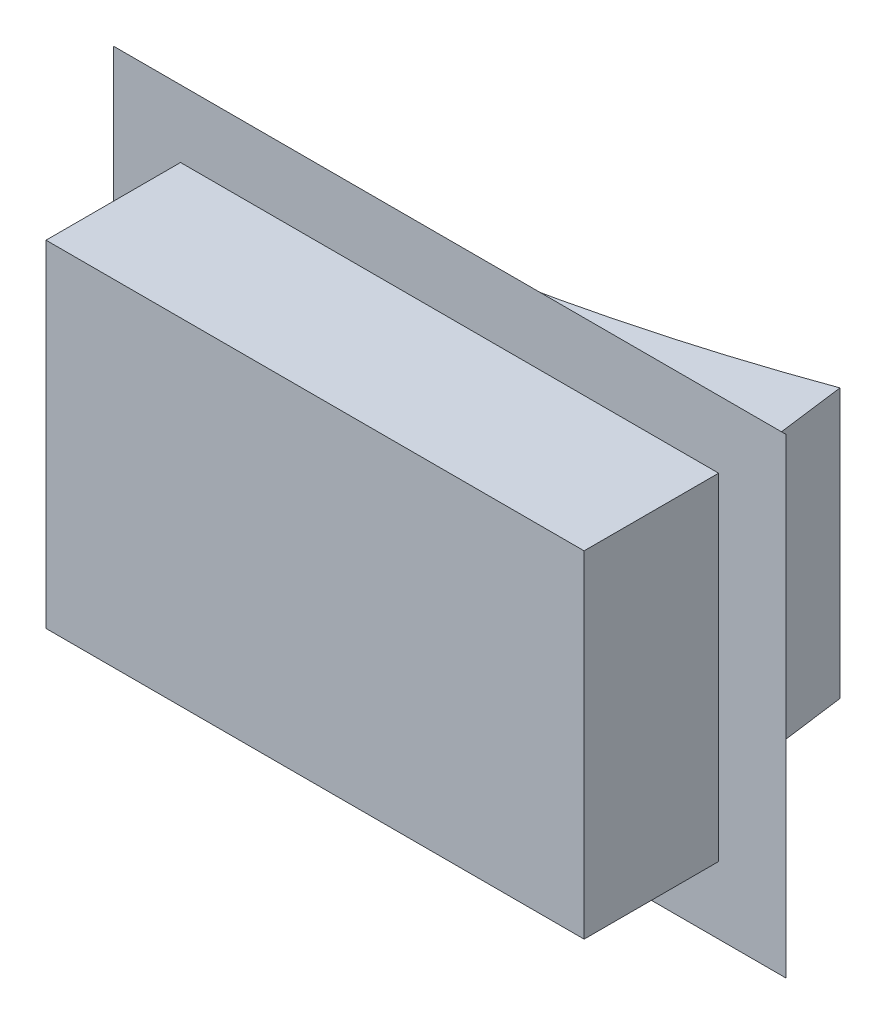
ISO-10303-21;
HEADER;
FILE_DESCRIPTION(('STEP AP214'),'2;1');
FILE_NAME('part.step','',(''),(''),'','','');
FILE_SCHEMA(('AUTOMOTIVE_DESIGN { 1 0 10303 214 1 1 1 1 }'));
ENDSEC;
DATA;
#1=APPLICATION_CONTEXT('core data for automotive mechanical design processes');
#2=APPLICATION_PROTOCOL_DEFINITION('international standard','automotive_design',2000,#1);
#3=PRODUCT_CONTEXT('',#1,'mechanical');
#4=PRODUCT('Part','Part','',(#3));
#5=PRODUCT_RELATED_PRODUCT_CATEGORY('part','',(#4));
#6=PRODUCT_DEFINITION_FORMATION('','',#4);
#7=PRODUCT_DEFINITION_CONTEXT('part definition',#1,'design');
#8=PRODUCT_DEFINITION('design','',#6,#7);
#9=PRODUCT_DEFINITION_SHAPE('','',#8);
#10=(LENGTH_UNIT() NAMED_UNIT(*) SI_UNIT(.MILLI.,.METRE.));
#11=(NAMED_UNIT(*) PLANE_ANGLE_UNIT() SI_UNIT($,.RADIAN.));
#12=(NAMED_UNIT(*) SI_UNIT($,.STERADIAN.) SOLID_ANGLE_UNIT());
#13=UNCERTAINTY_MEASURE_WITH_UNIT(LENGTH_MEASURE(1.E-05),#10,'distance_accuracy_value','');
#14=(GEOMETRIC_REPRESENTATION_CONTEXT(3) GLOBAL_UNCERTAINTY_ASSIGNED_CONTEXT((#13)) GLOBAL_UNIT_ASSIGNED_CONTEXT((#10,
#11,#12)) REPRESENTATION_CONTEXT('',''));
#15=CARTESIAN_POINT('',(0.,0.,0.));
#16=DIRECTION('',(0.,0.,1.));
#17=DIRECTION('',(1.,0.,0.));
#18=AXIS2_PLACEMENT_3D('',#15,#16,#17);
#19=CARTESIAN_POINT('',(6.99999999999999,-3.99999999999999,-3.));
#20=DIRECTION('',(0.,1.,0.));
#21=DIRECTION('',(0.,0.,1.));
#22=AXIS2_PLACEMENT_3D('',#19,#20,#21);
#23=PLANE('',#22);
#24=DIRECTION('',(-0.129572024776295,0.,-0.991570012856062));
#25=VECTOR('',#24,1.);
#26=CARTESIAN_POINT('',(6.61456079718034,-3.99999999999999,-2.94963327118611));
#27=LINE('',#26,#25);
#28=CARTESIAN_POINT('',(6.99999999999999,-3.99999999999999,0.));
#29=VERTEX_POINT('',#28);
#30=CARTESIAN_POINT('',(6.60797919532756,-3.99999999999999,-3.));
#31=VERTEX_POINT('',#30);
#32=EDGE_CURVE('E238',#29,#31,#27,.T.);
#33=ORIENTED_EDGE('',*,*,#32,.F.);
#34=DIRECTION('',(-1.,0.,0.));
#35=VECTOR('',#34,1.);
#36=CARTESIAN_POINT('',(6.99999999999999,-3.99999999999999,0.));
#37=LINE('',#36,#35);
#38=CARTESIAN_POINT('',(-6.99999999999999,-3.99999999999999,0.));
#39=VERTEX_POINT('',#38);
#40=EDGE_CURVE('E374',#29,#39,#37,.T.);
#41=ORIENTED_EDGE('',*,*,#40,.T.);
#42=CARTESIAN_POINT('',(6.60797919532756,-3.99999999999999,-3.));
#43=CARTESIAN_POINT('',(-0.0193159583533921,-3.99999999999999,-0.580486073640321));
#44=CARTESIAN_POINT('',(-6.99999999999999,-3.99999999999999,0.));
#45=B_SPLINE_CURVE_WITH_KNOTS('',2,(#42,#43,#44),.UNSPECIFIED.,.F.,.F.,(3,3),(0.,1.),.UNSPECIFIED.);
#46=EDGE_CURVE('E406',#31,#39,#45,.T.);
#47=ORIENTED_EDGE('',*,*,#46,.F.);
#48=EDGE_LOOP('',(#33,#41,#47));
#49=FACE_BOUND('',#48,.T.);
#50=ADVANCED_FACE('F59',(#49),#23,.F.);
#51=CARTESIAN_POINT('',(6.99999999999999,3.99999999999999,-3.));
#52=DIRECTION('',(0.,-1.,0.));
#53=DIRECTION('',(0.,0.,-1.));
#54=AXIS2_PLACEMENT_3D('',#51,#52,#53);
#55=PLANE('',#54);
#56=DIRECTION('',(-0.129572024776295,0.,-0.991570012856062));
#57=VECTOR('',#56,1.);
#58=CARTESIAN_POINT('',(6.88247763276759,3.99999999999999,-0.899358139912518));
#59=LINE('',#58,#57);
#60=CARTESIAN_POINT('',(6.99999999999999,3.99999999999999,0.));
#61=VERTEX_POINT('',#60);
#62=CARTESIAN_POINT('',(6.60797919532756,3.99999999999999,-3.));
#63=VERTEX_POINT('',#62);
#64=EDGE_CURVE('E235',#61,#63,#59,.T.);
#65=ORIENTED_EDGE('',*,*,#64,.T.);
#66=CARTESIAN_POINT('',(6.60797919532756,3.99999999999999,-3.));
#67=CARTESIAN_POINT('',(-0.0193159583533921,3.99999999999999,-0.580486073640321));
#68=CARTESIAN_POINT('',(-6.99999999999999,3.99999999999999,0.));
#69=B_SPLINE_CURVE_WITH_KNOTS('',2,(#66,#67,#68),.UNSPECIFIED.,.F.,.F.,(3,3),(0.,1.),.UNSPECIFIED.);
#70=CARTESIAN_POINT('',(-6.99999999999999,3.99999999999999,0.));
#71=VERTEX_POINT('',#70);
#72=EDGE_CURVE('E240',#63,#71,#69,.T.);
#73=ORIENTED_EDGE('',*,*,#72,.T.);
#74=DIRECTION('',(1.,0.,0.));
#75=VECTOR('',#74,1.);
#76=CARTESIAN_POINT('',(6.99999999999999,3.99999999999999,0.));
#77=LINE('',#76,#75);
#78=EDGE_CURVE('E373',#71,#61,#77,.T.);
#79=ORIENTED_EDGE('',*,*,#78,.T.);
#80=EDGE_LOOP('',(#65,#73,#79));
#81=FACE_BOUND('',#80,.T.);
#82=ADVANCED_FACE('F263',(#81),#55,.F.);
#83=CARTESIAN_POINT('',(0.,0.,0.));
#84=DIRECTION('',(0.,0.,1.));
#85=DIRECTION('',(1.,0.,0.));
#86=AXIS2_PLACEMENT_3D('',#83,#84,#85);
#87=PLANE('',#86);
#88=ORIENTED_EDGE('',*,*,#40,.F.);
#89=DIRECTION('',(0.,-1.,0.));
#90=VECTOR('',#89,1.);
#91=CARTESIAN_POINT('',(6.99999999999999,-3.99999999999999,0.));
#92=LINE('',#91,#90);
#93=EDGE_CURVE('E379',#61,#29,#92,.T.);
#94=ORIENTED_EDGE('',*,*,#93,.F.);
#95=ORIENTED_EDGE('',*,*,#78,.F.);
#96=DIRECTION('',(0.,1.,0.));
#97=VECTOR('',#96,1.);
#98=CARTESIAN_POINT('',(-6.99999999999999,-3.99999999999999,0.));
#99=LINE('',#98,#97);
#100=EDGE_CURVE('E371',#39,#71,#99,.T.);
#101=ORIENTED_EDGE('',*,*,#100,.F.);
#102=EDGE_LOOP('',(#88,#94,#95,#101));
#103=FACE_BOUND('',#102,.T.);
#104=DIRECTION('',(-1.,0.,0.));
#105=VECTOR('',#104,1.);
#106=CARTESIAN_POINT('',(0.,-4.99999999999999,0.));
#107=LINE('',#106,#105);
#108=CARTESIAN_POINT('',(7.99999999999999,-4.99999999999999,0.));
#109=VERTEX_POINT('',#108);
#110=CARTESIAN_POINT('',(-7.99999999999999,-4.99999999999999,0.));
#111=VERTEX_POINT('',#110);
#112=EDGE_CURVE('E430',#109,#111,#107,.T.);
#113=ORIENTED_EDGE('',*,*,#112,.T.);
#114=DIRECTION('',(0.,1.,0.));
#115=VECTOR('',#114,1.);
#116=CARTESIAN_POINT('',(-7.99999999999999,0.,0.));
#117=LINE('',#116,#115);
#118=CARTESIAN_POINT('',(-7.99999999999999,4.99999999999999,0.));
#119=VERTEX_POINT('',#118);
#120=EDGE_CURVE('E386',#111,#119,#117,.T.);
#121=ORIENTED_EDGE('',*,*,#120,.T.);
#122=DIRECTION('',(1.,0.,0.));
#123=VECTOR('',#122,1.);
#124=CARTESIAN_POINT('',(0.,4.99999999999999,0.));
#125=LINE('',#124,#123);
#126=CARTESIAN_POINT('',(7.99999999999999,4.99999999999999,0.));
#127=VERTEX_POINT('',#126);
#128=EDGE_CURVE('E355',#119,#127,#125,.T.);
#129=ORIENTED_EDGE('',*,*,#128,.T.);
#130=DIRECTION('',(0.,-1.,0.));
#131=VECTOR('',#130,1.);
#132=CARTESIAN_POINT('',(7.99999999999999,0.,0.));
#133=LINE('',#132,#131);
#134=EDGE_CURVE('E427',#127,#109,#133,.T.);
#135=ORIENTED_EDGE('',*,*,#134,.T.);
#136=EDGE_LOOP('',(#113,#121,#129,#135));
#137=FACE_BOUND('',#136,.T.);
#138=ADVANCED_FACE('F326',(#103,#137),#87,.F.);
#139=CARTESIAN_POINT('',(0.,0.,2.));
#140=DIRECTION('',(0.,0.,1.));
#141=DIRECTION('',(1.,0.,0.));
#142=AXIS2_PLACEMENT_3D('',#139,#140,#141);
#143=PLANE('',#142);
#144=DIRECTION('',(0.,-1.,0.));
#145=VECTOR('',#144,1.);
#146=CARTESIAN_POINT('',(-8.,5.,2.));
#147=LINE('',#146,#145);
#148=CARTESIAN_POINT('',(-8.,5.,2.));
#149=VERTEX_POINT('',#148);
#150=CARTESIAN_POINT('',(-8.,-5.,2.));
#151=VERTEX_POINT('',#150);
#152=EDGE_CURVE('E87',#149,#151,#147,.T.);
#153=ORIENTED_EDGE('',*,*,#152,.F.);
#154=DIRECTION('',(-1.,0.,0.));
#155=VECTOR('',#154,1.);
#156=CARTESIAN_POINT('',(-8.,5.,2.));
#157=LINE('',#156,#155);
#158=CARTESIAN_POINT('',(8.,5.,2.));
#159=VERTEX_POINT('',#158);
#160=EDGE_CURVE('E209',#159,#149,#157,.T.);
#161=ORIENTED_EDGE('',*,*,#160,.F.);
#162=DIRECTION('',(0.,1.,0.));
#163=VECTOR('',#162,1.);
#164=CARTESIAN_POINT('',(8.,5.,2.));
#165=LINE('',#164,#163);
#166=CARTESIAN_POINT('',(8.,-5.,2.));
#167=VERTEX_POINT('',#166);
#168=EDGE_CURVE('E220',#167,#159,#165,.T.);
#169=ORIENTED_EDGE('',*,*,#168,.F.);
#170=DIRECTION('',(1.,0.,0.));
#171=VECTOR('',#170,1.);
#172=CARTESIAN_POINT('',(-8.,-5.,2.));
#173=LINE('',#172,#171);
#174=EDGE_CURVE('E217',#151,#167,#173,.T.);
#175=ORIENTED_EDGE('',*,*,#174,.F.);
#176=EDGE_LOOP('',(#153,#161,#169,#175));
#177=FACE_BOUND('',#176,.T.);
#178=DIRECTION('',(0.,-1.,0.));
#179=VECTOR('',#178,1.);
#180=CARTESIAN_POINT('',(-10.,7.,2.));
#181=LINE('',#180,#179);
#182=CARTESIAN_POINT('',(-10.,7.,2.));
#183=VERTEX_POINT('',#182);
#184=CARTESIAN_POINT('',(-10.,-7.,2.));
#185=VERTEX_POINT('',#184);
#186=EDGE_CURVE('E360',#183,#185,#181,.T.);
#187=ORIENTED_EDGE('',*,*,#186,.T.);
#188=DIRECTION('',(1.,0.,0.));
#189=VECTOR('',#188,1.);
#190=CARTESIAN_POINT('',(-10.,-7.,2.));
#191=LINE('',#190,#189);
#192=CARTESIAN_POINT('',(10.,-7.,2.));
#193=VERTEX_POINT('',#192);
#194=EDGE_CURVE('E364',#185,#193,#191,.T.);
#195=ORIENTED_EDGE('',*,*,#194,.T.);
#196=DIRECTION('',(0.,1.,0.));
#197=VECTOR('',#196,1.);
#198=CARTESIAN_POINT('',(10.,7.,2.));
#199=LINE('',#198,#197);
#200=CARTESIAN_POINT('',(10.,7.,2.));
#201=VERTEX_POINT('',#200);
#202=EDGE_CURVE('E424',#193,#201,#199,.T.);
#203=ORIENTED_EDGE('',*,*,#202,.T.);
#204=DIRECTION('',(-1.,0.,0.));
#205=VECTOR('',#204,1.);
#206=CARTESIAN_POINT('',(-10.,7.,2.));
#207=LINE('',#206,#205);
#208=EDGE_CURVE('E357',#201,#183,#207,.T.);
#209=ORIENTED_EDGE('',*,*,#208,.T.);
#210=EDGE_LOOP('',(#187,#195,#203,#209));
#211=FACE_BOUND('',#210,.T.);
#212=ADVANCED_FACE('F330',(#177,#211),#143,.T.);
#213=CARTESIAN_POINT('',(10.,7.,2.00000000000001));
#214=DIRECTION('',(-0.707106781186546,0.,0.707106781186549));
#215=DIRECTION('',(0.,1.,0.));
#216=AXIS2_PLACEMENT_3D('',#213,#214,#215);
#217=PLANE('',#216);
#218=DIRECTION('',(-0.577350269189626,0.577350269189627,-0.577350269189625));
#219=VECTOR('',#218,1.);
#220=CARTESIAN_POINT('',(5.33333333333332,-2.33333333333332,-2.66666666666666));
#221=LINE('',#220,#219);
#222=EDGE_CURVE('E361',#109,#193,#221,.F.);
#223=ORIENTED_EDGE('',*,*,#222,.F.);
#224=ORIENTED_EDGE('',*,*,#134,.F.);
#225=DIRECTION('',(0.577350269189627,0.577350269189626,0.577350269189624));
#226=VECTOR('',#225,1.);
#227=CARTESIAN_POINT('',(10.,7.,2.00000000000001));
#228=LINE('',#227,#226);
#229=EDGE_CURVE('E353',#201,#127,#228,.F.);
#230=ORIENTED_EDGE('',*,*,#229,.F.);
#231=ORIENTED_EDGE('',*,*,#202,.F.);
#232=EDGE_LOOP('',(#223,#224,#230,#231));
#233=FACE_BOUND('',#232,.T.);
#234=ADVANCED_FACE('F61',(#233),#217,.F.);
#235=CARTESIAN_POINT('',(-10.,7.,2.00000000000001));
#236=DIRECTION('',(0.,-0.707106781186546,0.707106781186549));
#237=DIRECTION('',(-1.,0.,0.));
#238=AXIS2_PLACEMENT_3D('',#235,#236,#237);
#239=PLANE('',#238);
#240=ORIENTED_EDGE('',*,*,#229,.T.);
#241=ORIENTED_EDGE('',*,*,#128,.F.);
#242=DIRECTION('',(-0.577350269189627,0.577350269189626,0.577350269189624));
#243=VECTOR('',#242,1.);
#244=CARTESIAN_POINT('',(-10.,7.,2.00000000000001));
#245=LINE('',#244,#243);
#246=EDGE_CURVE('E367',#183,#119,#245,.F.);
#247=ORIENTED_EDGE('',*,*,#246,.F.);
#248=ORIENTED_EDGE('',*,*,#208,.F.);
#249=EDGE_LOOP('',(#240,#241,#247,#248));
#250=FACE_BOUND('',#249,.T.);
#251=ADVANCED_FACE('F341',(#250),#239,.F.);
#252=CARTESIAN_POINT('',(-10.,-7.,2.00000000000001));
#253=DIRECTION('',(0.,0.707106781186546,0.707106781186549));
#254=DIRECTION('',(1.,0.,0.));
#255=AXIS2_PLACEMENT_3D('',#252,#253,#254);
#256=PLANE('',#255);
#257=ORIENTED_EDGE('',*,*,#222,.T.);
#258=ORIENTED_EDGE('',*,*,#194,.F.);
#259=DIRECTION('',(0.577350269189626,0.577350269189627,-0.577350269189625));
#260=VECTOR('',#259,1.);
#261=CARTESIAN_POINT('',(-10.,-7.,2.00000000000001));
#262=LINE('',#261,#260);
#263=EDGE_CURVE('E421',#111,#185,#262,.F.);
#264=ORIENTED_EDGE('',*,*,#263,.F.);
#265=ORIENTED_EDGE('',*,*,#112,.F.);
#266=EDGE_LOOP('',(#257,#258,#264,#265));
#267=FACE_BOUND('',#266,.T.);
#268=ADVANCED_FACE('F338',(#267),#256,.F.);
#269=CARTESIAN_POINT('',(-10.,7.,2.00000000000001));
#270=DIRECTION('',(0.707106781186546,0.,0.707106781186549));
#271=DIRECTION('',(0.,-1.,0.));
#272=AXIS2_PLACEMENT_3D('',#269,#270,#271);
#273=PLANE('',#272);
#274=ORIENTED_EDGE('',*,*,#246,.T.);
#275=ORIENTED_EDGE('',*,*,#120,.F.);
#276=ORIENTED_EDGE('',*,*,#263,.T.);
#277=ORIENTED_EDGE('',*,*,#186,.F.);
#278=EDGE_LOOP('',(#274,#275,#276,#277));
#279=FACE_BOUND('',#278,.T.);
#280=ADVANCED_FACE('F259',(#279),#273,.F.);
#281=CARTESIAN_POINT('',(6.60797919532756,-7.,-3.));
#282=CARTESIAN_POINT('',(-0.0193159583533921,-7.,-0.580486073640321));
#283=CARTESIAN_POINT('',(-6.99999999999999,-7.,0.));
#284=B_SPLINE_CURVE_WITH_KNOTS('',2,(#281,#282,#283),.UNSPECIFIED.,.F.,.F.,(3,3),(0.,1.),.UNSPECIFIED.);
#285=DIRECTION('',(0.,1.,0.));
#286=VECTOR('',#285,1.);
#287=SURFACE_OF_LINEAR_EXTRUSION('',#284,#286);
#288=CARTESIAN_POINT('',(1.65480843202351,0.,-1.46116990666255));
#289=CARTESIAN_POINT('',(1.65481341233763,0.112664800283501,-1.46117084827088));
#290=CARTESIAN_POINT('',(1.66404705270996,0.22541058939595,-1.46354440550255));
#291=CARTESIAN_POINT('',(1.70073725397097,0.447787466047836,-1.47300723441244));
#292=CARTESIAN_POINT('',(1.72821549737535,0.557414685515593,-1.48010211709925));
#293=CARTESIAN_POINT('',(1.80056092337885,0.770292897302324,-1.49888589938621));
#294=CARTESIAN_POINT('',(1.84541784947889,0.873547608937413,-1.51057208935952));
#295=CARTESIAN_POINT('',(1.95116598911321,1.07080665406106,-1.53832840481656));
#296=CARTESIAN_POINT('',(2.01205335250087,1.16481320131119,-1.55439747766476));
#297=CARTESIAN_POINT('',(2.14824268002035,1.34123433585223,-1.59066885764276));
#298=CARTESIAN_POINT('',(2.22358292240596,1.42361710899337,-1.61088215068325));
#299=CARTESIAN_POINT('',(2.38635302261262,1.57423480648571,-1.65501107461084));
#300=CARTESIAN_POINT('',(2.47378368130846,1.64246879286573,-1.6789269507713));
#301=CARTESIAN_POINT('',(2.65885517205477,1.7633928348455,-1.73013202447015));
#302=CARTESIAN_POINT('',(2.75656443130673,1.81596845820123,-1.75744408280176));
#303=CARTESIAN_POINT('',(2.95885224913992,1.90354338412519,-1.8146746492243));
#304=CARTESIAN_POINT('',(3.06343115486114,1.93854179770029,-1.84459328905712));
#305=CARTESIAN_POINT('',(3.27758534794232,1.99035328705018,-1.90661655981823));
#306=CARTESIAN_POINT('',(3.3872004511933,2.00697898619254,-1.93874022851731));
#307=CARTESIAN_POINT('',(3.60734142661627,2.0210342489472,-2.0040497127107));
#308=CARTESIAN_POINT('',(3.7178673531134,2.01846265915706,-2.03723559190495));
#309=CARTESIAN_POINT('',(3.93783877551272,1.99412981457498,-2.10406521778934));
#310=CARTESIAN_POINT('',(4.04726323994485,1.97218176179698,-2.13771027451615));
#311=CARTESIAN_POINT('',(4.26086405346146,1.90946427013051,-2.20411980128668));
#312=CARTESIAN_POINT('',(4.36504018837662,1.86869406385268,-2.2368842353693));
#313=CARTESIAN_POINT('',(4.56558433868663,1.7692538455742,-2.30059411631693));
#314=CARTESIAN_POINT('',(4.66192307530879,1.71052029426575,-2.33153263355624));
#315=CARTESIAN_POINT('',(4.84361074487317,1.5767861117278,-2.39039514294641));
#316=CARTESIAN_POINT('',(4.92895994801507,1.50178588056892,-2.41831920921084));
#317=CARTESIAN_POINT('',(5.08556669817263,1.33817912283294,-2.46993166334587));
#318=CARTESIAN_POINT('',(5.15692406808092,1.24967764039768,-2.49364993117687));
#319=CARTESIAN_POINT('',(5.28416937231153,1.06112480673302,-2.53618218236411));
#320=CARTESIAN_POINT('',(5.34005879970841,0.961074571592516,-2.55499663906046));
#321=CARTESIAN_POINT('',(5.4338179760889,0.754053645885342,-2.58668092181251));
#322=CARTESIAN_POINT('',(5.47197431644078,0.64722722471846,-2.59964518734543));
#323=CARTESIAN_POINT('',(5.53042829718103,0.428260325908575,-2.61954569348763));
#324=CARTESIAN_POINT('',(5.55072787954134,0.316120427519188,-2.62648258958905));
#325=CARTESIAN_POINT('',(5.57263296222515,0.0916963116153321,-2.63396951866888));
#326=CARTESIAN_POINT('',(5.57454149763367,-0.0205549712275451,-2.63462308365859));
#327=CARTESIAN_POINT('',(5.56039560049537,-0.243781904550802,-2.62978639712733));
#328=CARTESIAN_POINT('',(5.54434198183619,-0.354757612598891,-2.62429642397775));
#329=CARTESIAN_POINT('',(5.49490806370793,-0.571699442172992,-2.60744670385495));
#330=CARTESIAN_POINT('',(5.46161808407243,-0.677688565806307,-2.596117555991));
#331=CARTESIAN_POINT('',(5.37877907773284,-0.882340809093533,-2.56806343376963));
#332=CARTESIAN_POINT('',(5.32922943069089,-0.981003649059367,-2.55133825354352));
#333=CARTESIAN_POINT('',(5.2147861907529,-1.1692479219407,-2.51295463335315));
#334=CARTESIAN_POINT('',(5.14975095875642,-1.25873391581195,-2.4912507267995));
#335=CARTESIAN_POINT('',(5.0064709177009,-1.42518153366579,-2.44380798989292));
#336=CARTESIAN_POINT('',(4.92822491508212,-1.50214202476587,-2.4180687949769));
#337=CARTESIAN_POINT('',(4.75921084514469,-1.64279693556785,-2.36297251644969));
#338=CARTESIAN_POINT('',(4.66824608043816,-1.7062331386472,-2.33355957924783));
#339=CARTESIAN_POINT('',(4.4774115390904,-1.81644072638669,-2.27248518689078));
#340=CARTESIAN_POINT('',(4.37754100017062,-1.86321068280538,-2.24082353930737));
#341=CARTESIAN_POINT('',(4.17008568547058,-1.93942812590641,-2.1757804072069));
#342=CARTESIAN_POINT('',(4.06240845941434,-1.96860838483939,-2.14238037875579));
#343=CARTESIAN_POINT('',(3.84368617973031,-2.00774094864658,-2.07533387096633));
#344=CARTESIAN_POINT('',(3.73264099617735,-2.01769251077764,-2.0416873821584));
#345=CARTESIAN_POINT('',(3.50978922110098,-2.01804637665744,-1.97497573692674));
#346=CARTESIAN_POINT('',(3.39798146168729,-2.00835971505353,-1.94191391355813));
#347=CARTESIAN_POINT('',(3.1773230063116,-1.96945057556004,-1.87744813232416));
#348=CARTESIAN_POINT('',(3.06847224926305,-1.94022850155814,-1.84604414019822));
#349=CARTESIAN_POINT('',(2.85751713148761,-1.86320627869594,-1.78588654496104));
#350=CARTESIAN_POINT('',(2.7553782613066,-1.8155115735085,-1.75711902493991));
#351=CARTESIAN_POINT('',(2.56022033457852,-1.70281141466052,-1.70274051951436));
#352=CARTESIAN_POINT('',(2.46720043840801,-1.63780755678061,-1.67712924344496));
#353=CARTESIAN_POINT('',(2.29400839850426,-1.4930613385553,-1.62989744081987));
#354=CARTESIAN_POINT('',(2.21371183020602,-1.41348057199154,-1.60823790520514));
#355=CARTESIAN_POINT('',(2.0672117389465,-1.24134495916582,-1.56903245636426));
#356=CARTESIAN_POINT('',(2.00101097404796,-1.14878757969301,-1.55148734812175));
#357=CARTESIAN_POINT('',(1.88528519357723,-0.954269752369079,-1.52100284386336));
#358=CARTESIAN_POINT('',(1.83561399181287,-0.852402479040277,-1.50802301123006));
#359=CARTESIAN_POINT('',(1.75367659840654,-0.64153737688185,-1.48669614691057));
#360=CARTESIAN_POINT('',(1.72138889377021,-0.532548549629497,-1.47834338860393));
#361=CARTESIAN_POINT('',(1.68382589899677,-0.352375896058858,-1.46864357546745));
#362=CARTESIAN_POINT('',(1.67295878066206,-0.282383643832943,-1.46584329098703));
#363=CARTESIAN_POINT('',(1.65844849398943,-0.141604925762726,-1.4621061637612));
#364=CARTESIAN_POINT('',(1.65480530151436,-0.0708184625729001,-1.46116931478954));
#365=CARTESIAN_POINT('',(1.65480843202351,0.,-1.46116990666255));
#366=B_SPLINE_CURVE_WITH_KNOTS('',3,(#288,#289,#290,#291,#292,#293,#294,#295,#296,#297,#298,
#299,#300,#301,#302,#303,#304,#305,#306,#307,#308,#309,#310,#311,#312,#313,#314,#315,#316,#317,
#318,#319,#320,#321,#322,#323,#324,#325,#326,#327,#328,#329,#330,#331,#332,#333,#334,#335,#336,
#337,#338,#339,#340,#341,#342,#343,#344,#345,#346,#347,#348,#349,#350,#351,#352,#353,#354,#355,
#356,#357,#358,#359,#360,#361,#362,#363,#364,#365),.UNSPECIFIED.,.T.,.F.,(4,2,2,2,2,2,2,2,2,2,2,
2,2,2,2,2,2,2,2,2,2,2,2,2,2,2,2,2,2,2,2,2,2,2,2,2,2,2,4),(0.,0.337735239498443,
0.675872575355776,1.01381065358255,1.35166764069082,1.6904321096018,2.02921902918659,
2.37042427283625,2.71164677170357,3.05631804762945,3.40101003209882,3.74906174073406,
4.09712764087888,4.44643923208341,4.79574223312293,5.14245444563248,5.48913317935966,
5.82999554882133,6.17082084397066,6.50602045508494,6.84120487850103,7.17465042405006,
7.50810869267282,7.84474276780297,8.18140727326194,8.52401591961222,8.86665391931811,
9.21437414630054,9.56210780433633,9.91142029007238,10.260725554121,10.6080656546468,
10.9553737439687,11.2990421550401,11.642777748503,11.9833871486186,12.3235740520346,
12.5358672463109,12.7481597312555),.UNSPECIFIED.);
#367=CARTESIAN_POINT('',(1.65480843202351,0.,-1.46116990666255));
#368=VERTEX_POINT('',#367);
#369=EDGE_CURVE('E63',#368,#368,#366,.T.);
#370=ORIENTED_EDGE('',*,*,#369,.F.);
#371=EDGE_LOOP('',(#370));
#372=FACE_BOUND('',#371,.T.);
#373=DIRECTION('',(0.,1.,0.));
#374=VECTOR('',#373,1.);
#375=CARTESIAN_POINT('',(-1.07242692866783,0.,-0.837152206251275));
#376=LINE('',#375,#374);
#377=CARTESIAN_POINT('',(-1.07242692866783,0.15,-0.837152206251279));
#378=VERTEX_POINT('',#377);
#379=CARTESIAN_POINT('',(-1.07242692866777,-0.149999999999999,-0.837152206251287));
#380=VERTEX_POINT('',#379);
#381=EDGE_CURVE('E12',#378,#380,#376,.F.);
#382=ORIENTED_EDGE('',*,*,#381,.F.);
#383=CARTESIAN_POINT('',(6.60797919532756,0.150000000000001,-3.));
#384=CARTESIAN_POINT('',(-0.0193159583533921,0.150000000000001,-0.580486073640321));
#385=CARTESIAN_POINT('',(-6.99999999999999,0.150000000000001,0.));
#386=B_SPLINE_CURVE_WITH_KNOTS('',2,(#383,#384,#385),.UNSPECIFIED.,.F.,.F.,(3,3),(0.,1.),.UNSPECIFIED.);
#387=CARTESIAN_POINT('',(-5.28088812881384,0.150000000000001,-0.1714611430031));
#388=VERTEX_POINT('',#387);
#389=EDGE_CURVE('E72',#388,#378,#386,.F.);
#390=ORIENTED_EDGE('',*,*,#389,.F.);
#391=DIRECTION('',(0.,1.,0.));
#392=VECTOR('',#391,1.);
#393=CARTESIAN_POINT('',(-5.28088812881384,0.,-0.1714611430031));
#394=LINE('',#393,#392);
#395=CARTESIAN_POINT('',(-5.28088812880434,-0.149999999999999,-0.171461142930383));
#396=VERTEX_POINT('',#395);
#397=EDGE_CURVE('E392',#396,#388,#394,.T.);
#398=ORIENTED_EDGE('',*,*,#397,.F.);
#399=CARTESIAN_POINT('',(6.60797919532756,-0.149999999999999,-3.));
#400=CARTESIAN_POINT('',(-0.0193159583533921,-0.149999999999999,-0.580486073640321));
#401=CARTESIAN_POINT('',(-6.99999999999999,-0.149999999999999,0.));
#402=B_SPLINE_CURVE_WITH_KNOTS('',2,(#399,#400,#401),.UNSPECIFIED.,.F.,.F.,(3,3),(0.,1.),.UNSPECIFIED.);
#403=EDGE_CURVE('E385',#380,#396,#402,.T.);
#404=ORIENTED_EDGE('',*,*,#403,.F.);
#405=EDGE_LOOP('',(#382,#390,#398,#404));
#406=FACE_BOUND('',#405,.T.);
#407=ORIENTED_EDGE('',*,*,#46,.T.);
#408=ORIENTED_EDGE('',*,*,#100,.T.);
#409=ORIENTED_EDGE('',*,*,#72,.F.);
#410=DIRECTION('',(0.,1.,0.));
#411=VECTOR('',#410,1.);
#412=CARTESIAN_POINT('',(6.60797919532756,-7.,-3.));
#413=LINE('',#412,#411);
#414=EDGE_CURVE('E382',#63,#31,#413,.F.);
#415=ORIENTED_EDGE('',*,*,#414,.T.);
#416=EDGE_LOOP('',(#407,#408,#409,#415));
#417=FACE_BOUND('',#416,.T.);
#418=ADVANCED_FACE('F253',(#372,#406,#417),#287,.T.);
#419=CARTESIAN_POINT('',(6.88247763276759,-7.,-0.899358139912518));
#420=DIRECTION('',(0.991570012856062,0.,-0.129572024776295));
#421=DIRECTION('',(-0.129572024776295,0.,-0.991570012856062));
#422=AXIS2_PLACEMENT_3D('',#419,#420,#421);
#423=PLANE('',#422);
#424=ORIENTED_EDGE('',*,*,#32,.T.);
#425=ORIENTED_EDGE('',*,*,#414,.F.);
#426=ORIENTED_EDGE('',*,*,#64,.F.);
#427=ORIENTED_EDGE('',*,*,#93,.T.);
#428=EDGE_LOOP('',(#424,#425,#426,#427));
#429=FACE_BOUND('',#428,.T.);
#430=ADVANCED_FACE('F258',(#429),#423,.T.);
#431=CARTESIAN_POINT('',(-8.,5.,6.));
#432=DIRECTION('',(1.,0.,0.));
#433=DIRECTION('',(0.,1.,0.));
#434=AXIS2_PLACEMENT_3D('',#431,#432,#433);
#435=PLANE('',#434);
#436=ORIENTED_EDGE('',*,*,#152,.T.);
#437=DIRECTION('',(0.,0.,-1.));
#438=VECTOR('',#437,1.);
#439=CARTESIAN_POINT('',(-8.,-5.,6.));
#440=LINE('',#439,#438);
#441=CARTESIAN_POINT('',(-8.,-5.,6.));
#442=VERTEX_POINT('',#441);
#443=EDGE_CURVE('E232',#442,#151,#440,.T.);
#444=ORIENTED_EDGE('',*,*,#443,.F.);
#445=DIRECTION('',(0.,-1.,0.));
#446=VECTOR('',#445,1.);
#447=CARTESIAN_POINT('',(-8.,5.,6.));
#448=LINE('',#447,#446);
#449=CARTESIAN_POINT('',(-8.,5.,6.));
#450=VERTEX_POINT('',#449);
#451=EDGE_CURVE('E205',#450,#442,#448,.T.);
#452=ORIENTED_EDGE('',*,*,#451,.F.);
#453=DIRECTION('',(0.,0.,-1.));
#454=VECTOR('',#453,1.);
#455=CARTESIAN_POINT('',(-8.,5.,6.));
#456=LINE('',#455,#454);
#457=EDGE_CURVE('E215',#450,#149,#456,.T.);
#458=ORIENTED_EDGE('',*,*,#457,.T.);
#459=EDGE_LOOP('',(#436,#444,#452,#458));
#460=FACE_BOUND('',#459,.T.);
#461=ADVANCED_FACE('F313',(#460),#435,.F.);
#462=CARTESIAN_POINT('',(-8.,-5.,6.));
#463=DIRECTION('',(0.,1.,0.));
#464=DIRECTION('',(0.,0.,1.));
#465=AXIS2_PLACEMENT_3D('',#462,#463,#464);
#466=PLANE('',#465);
#467=ORIENTED_EDGE('',*,*,#174,.T.);
#468=DIRECTION('',(0.,0.,-1.));
#469=VECTOR('',#468,1.);
#470=CARTESIAN_POINT('',(8.,-5.,6.));
#471=LINE('',#470,#469);
#472=CARTESIAN_POINT('',(8.,-5.,6.));
#473=VERTEX_POINT('',#472);
#474=EDGE_CURVE('E229',#473,#167,#471,.T.);
#475=ORIENTED_EDGE('',*,*,#474,.F.);
#476=DIRECTION('',(1.,0.,0.));
#477=VECTOR('',#476,1.);
#478=CARTESIAN_POINT('',(-8.,-5.,6.));
#479=LINE('',#478,#477);
#480=EDGE_CURVE('E208',#442,#473,#479,.T.);
#481=ORIENTED_EDGE('',*,*,#480,.F.);
#482=ORIENTED_EDGE('',*,*,#443,.T.);
#483=EDGE_LOOP('',(#467,#475,#481,#482));
#484=FACE_BOUND('',#483,.T.);
#485=ADVANCED_FACE('F310',(#484),#466,.F.);
#486=CARTESIAN_POINT('',(8.,5.,6.));
#487=DIRECTION('',(-1.,0.,0.));
#488=DIRECTION('',(0.,-1.,0.));
#489=AXIS2_PLACEMENT_3D('',#486,#487,#488);
#490=PLANE('',#489);
#491=ORIENTED_EDGE('',*,*,#168,.T.);
#492=DIRECTION('',(0.,0.,-1.));
#493=VECTOR('',#492,1.);
#494=CARTESIAN_POINT('',(8.,5.,6.));
#495=LINE('',#494,#493);
#496=CARTESIAN_POINT('',(8.,5.,6.));
#497=VERTEX_POINT('',#496);
#498=EDGE_CURVE('E226',#497,#159,#495,.T.);
#499=ORIENTED_EDGE('',*,*,#498,.F.);
#500=DIRECTION('',(0.,1.,0.));
#501=VECTOR('',#500,1.);
#502=CARTESIAN_POINT('',(8.,5.,6.));
#503=LINE('',#502,#501);
#504=EDGE_CURVE('E211',#473,#497,#503,.T.);
#505=ORIENTED_EDGE('',*,*,#504,.F.);
#506=ORIENTED_EDGE('',*,*,#474,.T.);
#507=EDGE_LOOP('',(#491,#499,#505,#506));
#508=FACE_BOUND('',#507,.T.);
#509=ADVANCED_FACE('F306',(#508),#490,.F.);
#510=CARTESIAN_POINT('',(-8.,5.,6.));
#511=DIRECTION('',(0.,-1.,0.));
#512=DIRECTION('',(0.,0.,-1.));
#513=AXIS2_PLACEMENT_3D('',#510,#511,#512);
#514=PLANE('',#513);
#515=ORIENTED_EDGE('',*,*,#160,.T.);
#516=ORIENTED_EDGE('',*,*,#457,.F.);
#517=DIRECTION('',(-1.,0.,0.));
#518=VECTOR('',#517,1.);
#519=CARTESIAN_POINT('',(-8.,5.,6.));
#520=LINE('',#519,#518);
#521=EDGE_CURVE('E213',#497,#450,#520,.T.);
#522=ORIENTED_EDGE('',*,*,#521,.F.);
#523=ORIENTED_EDGE('',*,*,#498,.T.);
#524=EDGE_LOOP('',(#515,#516,#522,#523));
#525=FACE_BOUND('',#524,.T.);
#526=ADVANCED_FACE('F302',(#525),#514,.F.);
#527=CARTESIAN_POINT('',(0.,0.,6.));
#528=DIRECTION('',(0.,0.,1.));
#529=DIRECTION('',(1.,0.,0.));
#530=AXIS2_PLACEMENT_3D('',#527,#528,#529);
#531=PLANE('',#530);
#532=ORIENTED_EDGE('',*,*,#451,.T.);
#533=ORIENTED_EDGE('',*,*,#480,.T.);
#534=ORIENTED_EDGE('',*,*,#504,.T.);
#535=ORIENTED_EDGE('',*,*,#521,.T.);
#536=EDGE_LOOP('',(#532,#533,#534,#535));
#537=FACE_BOUND('',#536,.T.);
#538=ADVANCED_FACE('F299',(#537),#531,.T.);
#539=CARTESIAN_POINT('',(-1.02700535717504,0.15,-0.489556586696773));
#540=DIRECTION('',(0.991570012856062,0.,-0.129572024776295));
#541=DIRECTION('',(-0.129572024776295,0.,-0.991570012856062));
#542=AXIS2_PLACEMENT_3D('',#539,#540,#541);
#543=PLANE('',#542);
#544=ORIENTED_EDGE('',*,*,#381,.T.);
#545=DIRECTION('',(-0.129572024776295,0.,-0.991570012856062));
#546=VECTOR('',#545,1.);
#547=CARTESIAN_POINT('',(-1.02700535717504,-0.15,-0.489556586696773));
#548=LINE('',#547,#546);
#549=CARTESIAN_POINT('',(-1.02700535717504,-0.15,-0.489556586696773));
#550=VERTEX_POINT('',#549);
#551=EDGE_CURVE('E80',#550,#380,#548,.T.);
#552=ORIENTED_EDGE('',*,*,#551,.F.);
#553=DIRECTION('',(0.,-1.,0.));
#554=VECTOR('',#553,1.);
#555=CARTESIAN_POINT('',(-1.02700535717504,0.15,-0.489556586696773));
#556=LINE('',#555,#554);
#557=CARTESIAN_POINT('',(-1.02700535717504,0.15,-0.489556586696773));
#558=VERTEX_POINT('',#557);
#559=EDGE_CURVE('E173',#558,#550,#556,.T.);
#560=ORIENTED_EDGE('',*,*,#559,.F.);
#561=DIRECTION('',(-0.129572024776295,0.,-0.991570012856062));
#562=VECTOR('',#561,1.);
#563=CARTESIAN_POINT('',(-1.02700535717504,0.15,-0.489556586696773));
#564=LINE('',#563,#562);
#565=EDGE_CURVE('E198',#558,#378,#564,.T.);
#566=ORIENTED_EDGE('',*,*,#565,.T.);
#567=EDGE_LOOP('',(#544,#552,#560,#566));
#568=FACE_BOUND('',#567,.T.);
#569=ADVANCED_FACE('F170',(#568),#543,.F.);
#570=CARTESIAN_POINT('',(-5.2503388935714,0.150000000000001,0.0623216170826133));
#571=DIRECTION('',(0.,1.,0.));
#572=DIRECTION('',(-1.,0.,0.));
#573=AXIS2_PLACEMENT_3D('',#570,#571,#572);
#574=PLANE('',#573);
#575=ORIENTED_EDGE('',*,*,#389,.T.);
#576=ORIENTED_EDGE('',*,*,#565,.F.);
#577=DIRECTION('',(0.991570012856062,0.,-0.129572024776295));
#578=VECTOR('',#577,1.);
#579=CARTESIAN_POINT('',(-5.2503388935714,0.150000000000001,0.0623216170826133));
#580=LINE('',#579,#578);
#581=CARTESIAN_POINT('',(-5.2503388935714,0.150000000000001,0.0623216170826133));
#582=VERTEX_POINT('',#581);
#583=EDGE_CURVE('E178',#582,#558,#580,.T.);
#584=ORIENTED_EDGE('',*,*,#583,.F.);
#585=DIRECTION('',(-0.129572024776295,0.,-0.991570012856062));
#586=VECTOR('',#585,1.);
#587=CARTESIAN_POINT('',(-5.2503388935714,0.150000000000001,0.0623216170826133));
#588=LINE('',#587,#586);
#589=EDGE_CURVE('E201',#582,#388,#588,.T.);
#590=ORIENTED_EDGE('',*,*,#589,.T.);
#591=EDGE_LOOP('',(#575,#576,#584,#590));
#592=FACE_BOUND('',#591,.T.);
#593=ADVANCED_FACE('F287',(#592),#574,.F.);
#594=CARTESIAN_POINT('',(-5.2503388935714,0.150000000000001,0.0623216170826133));
#595=DIRECTION('',(-0.991570012856062,0.,0.129572024776295));
#596=DIRECTION('',(0.129572024776295,0.,0.991570012856062));
#597=AXIS2_PLACEMENT_3D('',#594,#595,#596);
#598=PLANE('',#597);
#599=ORIENTED_EDGE('',*,*,#397,.T.);
#600=ORIENTED_EDGE('',*,*,#589,.F.);
#601=DIRECTION('',(0.,1.,0.));
#602=VECTOR('',#601,1.);
#603=CARTESIAN_POINT('',(-5.2503388935714,0.150000000000001,0.0623216170826133));
#604=LINE('',#603,#602);
#605=CARTESIAN_POINT('',(-5.2503388935714,-0.149999999999999,0.0623216170826133));
#606=VERTEX_POINT('',#605);
#607=EDGE_CURVE('E187',#606,#582,#604,.T.);
#608=ORIENTED_EDGE('',*,*,#607,.F.);
#609=DIRECTION('',(-0.129572024776295,0.,-0.991570012856062));
#610=VECTOR('',#609,1.);
#611=CARTESIAN_POINT('',(-5.2503388935714,-0.149999999999999,0.0623216170826133));
#612=LINE('',#611,#610);
#613=EDGE_CURVE('E177',#606,#396,#612,.T.);
#614=ORIENTED_EDGE('',*,*,#613,.T.);
#615=EDGE_LOOP('',(#599,#600,#608,#614));
#616=FACE_BOUND('',#615,.T.);
#617=ADVANCED_FACE('F290',(#616),#598,.F.);
#618=CARTESIAN_POINT('',(-5.2503388935714,-0.149999999999999,0.0623216170826133));
#619=DIRECTION('',(0.,-1.,0.));
#620=DIRECTION('',(1.,0.,0.));
#621=AXIS2_PLACEMENT_3D('',#618,#619,#620);
#622=PLANE('',#621);
#623=ORIENTED_EDGE('',*,*,#403,.T.);
#624=ORIENTED_EDGE('',*,*,#613,.F.);
#625=DIRECTION('',(-0.991570012856062,0.,0.129572024776295));
#626=VECTOR('',#625,1.);
#627=CARTESIAN_POINT('',(-5.2503388935714,-0.149999999999999,0.0623216170826133));
#628=LINE('',#627,#626);
#629=EDGE_CURVE('E181',#550,#606,#628,.T.);
#630=ORIENTED_EDGE('',*,*,#629,.F.);
#631=ORIENTED_EDGE('',*,*,#551,.T.);
#632=EDGE_LOOP('',(#623,#624,#630,#631));
#633=FACE_BOUND('',#632,.T.);
#634=ADVANCED_FACE('F182',(#633),#622,.F.);
#635=CARTESIAN_POINT('',(-0.0801404002755858,0.,-0.61328684080339));
#636=DIRECTION('',(0.129572024776295,0.,0.991570012856062));
#637=DIRECTION('',(0.991570012856062,0.,-0.129572024776295));
#638=AXIS2_PLACEMENT_3D('',#635,#636,#637);
#639=PLANE('',#638);
#640=ORIENTED_EDGE('',*,*,#559,.T.);
#641=ORIENTED_EDGE('',*,*,#629,.T.);
#642=ORIENTED_EDGE('',*,*,#607,.T.);
#643=ORIENTED_EDGE('',*,*,#583,.T.);
#644=EDGE_LOOP('',(#640,#641,#642,#643));
#645=FACE_BOUND('',#644,.T.);
#646=ADVANCED_FACE('F189',(#645),#639,.F.);
#647=CARTESIAN_POINT('',(3.73547714134055,0.,-1.11188732713226));
#648=DIRECTION('',(-0.129572024776295,0.,-0.991570012856062));
#649=DIRECTION('',(-0.991570012856062,0.,0.129572024776295));
#650=AXIS2_PLACEMENT_3D('',#647,#648,#649);
#651=CYLINDRICAL_SURFACE('',#650,2.01787144779787);
#652=ORIENTED_EDGE('',*,*,#369,.T.);
#653=EDGE_LOOP('',(#652));
#654=FACE_BOUND('',#653,.T.);
#655=CARTESIAN_POINT('',(3.73547714134055,0.,-1.11188732713226));
#656=DIRECTION('',(-0.129572024776295,0.,-0.991570012856062));
#657=DIRECTION('',(-0.991570012856062,0.,0.129572024776295));
#658=AXIS2_PLACEMENT_3D('',#655,#656,#657);
#659=CIRCLE('',#658,2.01787144779787);
#660=CARTESIAN_POINT('',(1.73461632390573,0.,-0.850427637902812));
#661=VERTEX_POINT('',#660);
#662=EDGE_CURVE('E193',#661,#661,#659,.T.);
#663=ORIENTED_EDGE('',*,*,#662,.F.);
#664=EDGE_LOOP('',(#663));
#665=FACE_BOUND('',#664,.T.);
#666=ADVANCED_FACE('F279',(#654,#665),#651,.F.);
#667=CARTESIAN_POINT('',(3.73547714134055,0.,-1.11188732713226));
#668=DIRECTION('',(-0.129572024776295,0.,-0.991570012856062));
#669=DIRECTION('',(-0.991570012856062,0.,0.129572024776295));
#670=AXIS2_PLACEMENT_3D('',#667,#668,#669);
#671=PLANE('',#670);
#672=CARTESIAN_POINT('',(3.73547714134055,0.,-1.11188732713226));
#673=DIRECTION('',(-0.129572024776295,0.,-0.991570012856062));
#674=DIRECTION('',(-0.991570012856062,0.,0.129572024776295));
#675=AXIS2_PLACEMENT_3D('',#672,#673,#674);
#676=CIRCLE('',#675,1.81787144779787);
#677=CARTESIAN_POINT('',(1.93293032647695,0.,-0.87634204285807));
#678=VERTEX_POINT('',#677);
#679=EDGE_CURVE('E200',#678,#678,#676,.T.);
#680=ORIENTED_EDGE('',*,*,#679,.F.);
#681=EDGE_LOOP('',(#680));
#682=FACE_BOUND('',#681,.T.);
#683=ORIENTED_EDGE('',*,*,#662,.T.);
#684=EDGE_LOOP('',(#683));
#685=FACE_BOUND('',#684,.T.);
#686=ADVANCED_FACE('F276',(#682,#685),#671,.T.);
#687=CARTESIAN_POINT('',(3.73547714134055,0.,-1.11188732713226));
#688=DIRECTION('',(-0.129572024776295,0.,-0.991570012856062));
#689=DIRECTION('',(-0.991570012856062,0.,0.129572024776295));
#690=AXIS2_PLACEMENT_3D('',#687,#688,#689);
#691=CYLINDRICAL_SURFACE('',#690,1.81787144779787);
#692=CARTESIAN_POINT('',(1.84989633676706,0.,-1.51177252552799));
#693=CARTESIAN_POINT('',(1.84990082706623,0.101465485700603,-1.51177342338732));
#694=CARTESIAN_POINT('',(1.85820965057949,0.203004124270884,-1.51394375575693));
#695=CARTESIAN_POINT('',(1.89122473393924,0.403275666804026,-1.52259305774338));
#696=CARTESIAN_POINT('',(1.91595055627108,0.502005076745869,-1.5290771676732));
#697=CARTESIAN_POINT('',(1.98104794685431,0.693719654866152,-1.54623287958781));
#698=CARTESIAN_POINT('',(2.02141006277347,0.786708254137624,-1.55690195176003));
#699=CARTESIAN_POINT('',(2.11656091809183,0.964356768607264,-1.58222119152767));
#700=CARTESIAN_POINT('',(2.17134620620666,1.04901866963188,-1.59687040675156));
#701=CARTESIAN_POINT('',(2.29390394539371,1.20793036331974,-1.62990840157705));
#702=CARTESIAN_POINT('',(2.36171426829269,1.28214867207274,-1.64830809592777));
#703=CARTESIAN_POINT('',(2.50822308565148,1.4178478621885,-1.68843415219045));
#704=CARTESIAN_POINT('',(2.58692233177235,1.47932786349509,-1.7101607437688));
#705=CARTESIAN_POINT('',(2.75356195651046,1.58832153454984,-1.75663619032649));
#706=CARTESIAN_POINT('',(2.84156810550054,1.63572535453332,-1.78140678749938));
#707=CARTESIAN_POINT('',(3.02378639796922,1.7146955726269,-1.83325217818157));
#708=CARTESIAN_POINT('',(3.11799886543414,1.74626114319589,-1.8603270920039));
#709=CARTESIAN_POINT('',(3.3109647497646,1.79300763989226,-1.91639651477936));
#710=CARTESIAN_POINT('',(3.40975492786824,1.80801655717712,-1.94540791504636));
#711=CARTESIAN_POINT('',(3.60817879686602,1.82072241132475,-2.0043246702688));
#712=CARTESIAN_POINT('',(3.7078125368756,1.81841833313714,-2.03423007753695));
#713=CARTESIAN_POINT('',(3.90609305166561,1.79650195923424,-2.0943802709603));
#714=CARTESIAN_POINT('',(4.00472169471395,1.77672686447321,-2.12462560088414));
#715=CARTESIAN_POINT('',(4.19726360818485,1.72020313132508,-2.18426558417624));
#716=CARTESIAN_POINT('',(4.2911767047343,1.68345386756989,-2.21366020616002));
#717=CARTESIAN_POINT('',(4.47191582240147,1.59383853493858,-2.27074807331208));
#718=CARTESIAN_POINT('',(4.55871998618628,1.54092496423948,-2.29843601093321));
#719=CARTESIAN_POINT('',(4.7224318842649,1.42044504163717,-2.35107263468944));
#720=CARTESIAN_POINT('',(4.79933988810772,1.35287908896636,-2.3760213954308));
#721=CARTESIAN_POINT('',(4.94043884655256,1.20551656253789,-2.42209729292356));
#722=CARTESIAN_POINT('',(5.00472323645751,1.12581825559351,-2.44325239899393));
#723=CARTESIAN_POINT('',(5.11936106276569,0.956031357502529,-2.48117058004777));
#724=CARTESIAN_POINT('',(5.16971580924881,0.8659437445978,-2.49793406805408));
#725=CARTESIAN_POINT('',(5.25421586186753,0.679509831300144,-2.52616323373818));
#726=CARTESIAN_POINT('',(5.28861317464823,0.583290223167358,-2.53771119392289));
#727=CARTESIAN_POINT('',(5.3413165695395,0.386069347644658,-2.55543718939526));
#728=CARTESIAN_POINT('',(5.3596243222084,0.285068577824475,-2.56161578217668));
#729=CARTESIAN_POINT('',(5.37940419918206,0.0828656990932756,-2.56829233425582));
#730=CARTESIAN_POINT('',(5.38113786539943,-0.0183079920049227,-2.56887854202887));
#731=CARTESIAN_POINT('',(5.36839826797856,-0.219508531345203,-2.56457694223624));
#732=CARTESIAN_POINT('',(5.35392570945958,-0.319535429292005,-2.55968937283002));
#733=CARTESIAN_POINT('',(5.30934034315312,-0.515102083247159,-2.54467741083651));
#734=CARTESIAN_POINT('',(5.27930512594806,-0.61066155908228,-2.53457899891415));
#735=CARTESIAN_POINT('',(5.20455445678233,-0.795174637064667,-2.50955805198116));
#736=CARTESIAN_POINT('',(5.15983847830755,-0.884128002148571,-2.49463534395118));
#737=CARTESIAN_POINT('',(5.05657638762334,-1.05380162568621,-2.46037444446158));
#738=CARTESIAN_POINT('',(4.99790853568705,-1.13443990802901,-2.44099743887774));
#739=CARTESIAN_POINT('',(4.86865969520072,-1.28442081517253,-2.398612076834));
#740=CARTESIAN_POINT('',(4.79807767575374,-1.3537624614883,-2.37560340614828));
#741=CARTESIAN_POINT('',(4.64567807108457,-1.48043346707678,-2.32633053279289));
#742=CARTESIAN_POINT('',(4.56369006682041,-1.53753888238117,-2.30001768803456));
#743=CARTESIAN_POINT('',(4.3917077936397,-1.63673505251516,-2.24533425667688));
#744=CARTESIAN_POINT('',(4.30171285412626,-1.67882454824962,-2.21696349775991));
#745=CARTESIAN_POINT('',(4.1148166373913,-1.74739070916216,-2.15863336772704));
#746=CARTESIAN_POINT('',(4.01783368308643,-1.77363034547661,-2.12865684543194));
#747=CARTESIAN_POINT('',(3.82086092019107,-1.80880221171458,-2.06842141393945));
#748=CARTESIAN_POINT('',(3.72087098930029,-1.81773373671007,-2.03816249329092));
#749=CARTESIAN_POINT('',(3.52018840716945,-1.81800665271576,-1.97809028200817));
#750=CARTESIAN_POINT('',(3.41949472743375,-1.80926075576155,-1.94827993857559));
#751=CARTESIAN_POINT('',(3.22079023744559,-1.77418237232392,-1.89008899387894));
#752=CARTESIAN_POINT('',(3.12277938199523,-1.74785018230921,-1.86170836852144));
#753=CARTESIAN_POINT('',(2.93278900508142,-1.678443990835,-1.80726484598616));
#754=CARTESIAN_POINT('',(2.8407815958903,-1.63545496764833,-1.78119099665497));
#755=CARTESIAN_POINT('',(2.66499407198578,-1.53387837179244,-1.73185232499933));
#756=CARTESIAN_POINT('',(2.58121321246373,-1.47529221302973,-1.70858724833263));
#757=CARTESIAN_POINT('',(2.42521654694662,-1.34482472141859,-1.66563686634745));
#758=CARTESIAN_POINT('',(2.35289070819033,-1.27308625106655,-1.6459172202768));
#759=CARTESIAN_POINT('',(2.22094473817028,-1.11791081094585,-1.61019572529585));
#760=CARTESIAN_POINT('',(2.16132708331705,-1.03447156632021,-1.59419460094944));
#761=CARTESIAN_POINT('',(2.05714032418729,-0.859140395894883,-1.56638249778878));
#762=CARTESIAN_POINT('',(2.01243504640675,-0.767335287157306,-1.55453354967011));
#763=CARTESIAN_POINT('',(1.93870578431377,-0.5772996618525,-1.53506054600896));
#764=CARTESIAN_POINT('',(1.90966230586104,-0.479077304409239,-1.52743123800282));
#765=CARTESIAN_POINT('',(1.87592370852433,-0.316843507370405,-1.51858285766406));
#766=CARTESIAN_POINT('',(1.86617638338122,-0.25390779462558,-1.51603125884887));
#767=CARTESIAN_POINT('',(1.85316130036085,-0.127324323088103,-1.51262581414993));
#768=CARTESIAN_POINT('',(1.84989351879567,-0.063676566899394,-1.51177196205954));
#769=CARTESIAN_POINT('',(1.84989633676706,0.,-1.51177252552799));
#770=B_SPLINE_CURVE_WITH_KNOTS('',3,(#692,#693,#694,#695,#696,#697,#698,#699,#700,#701,#702,
#703,#704,#705,#706,#707,#708,#709,#710,#711,#712,#713,#714,#715,#716,#717,#718,#719,#720,#721,
#722,#723,#724,#725,#726,#727,#728,#729,#730,#731,#732,#733,#734,#735,#736,#737,#738,#739,#740,
#741,#742,#743,#744,#745,#746,#747,#748,#749,#750,#751,#752,#753,#754,#755,#756,#757,#758,#759,
#760,#761,#762,#763,#764,#765,#766,#767,#768,#769),.UNSPECIFIED.,.T.,.F.,(4,2,2,2,2,2,2,2,2,2,2,
2,2,2,2,2,2,2,2,2,2,2,2,2,2,2,2,2,2,2,2,2,2,2,2,2,2,2,4),(0.,0.304163334921484,
0.608689762708974,0.913032387056315,1.21730225211479,1.5224705894119,1.8276600029623,
2.1351720215205,2.44270010576494,2.75339389172032,3.06410589360556,3.37774408433532,
3.69139383115162,4.00597431030965,4.32054621919257,4.63269390856833,4.94481223053383,
5.2518179169262,5.55879172354614,5.86091327955401,6.16302169101683,6.46363817371434,
6.76426543896684,7.06761890789026,7.37099863854056,7.67952939219288,7.98808601028304,
8.30114956550356,8.61422587096785,8.92885186795485,9.2434725611287,9.55650884869024,
9.8695167686443,10.1793070359309,10.4891576161602,10.7960959358721,11.102651324411,
11.2935354227521,11.4844188232575),.UNSPECIFIED.);
#771=CARTESIAN_POINT('',(1.84989633676706,0.,-1.51177252552799));
#772=VERTEX_POINT('',#771);
#773=EDGE_CURVE('E266',#772,#772,#770,.T.);
#774=ORIENTED_EDGE('',*,*,#773,.F.);
#775=EDGE_LOOP('',(#774));
#776=FACE_BOUND('',#775,.T.);
#777=ORIENTED_EDGE('',*,*,#679,.T.);
#778=EDGE_LOOP('',(#777));
#779=FACE_BOUND('',#778,.T.);
#780=ADVANCED_FACE('F272',(#776,#779),#691,.T.);
#781=ORIENTED_EDGE('',*,*,#773,.T.);
#782=EDGE_LOOP('',(#781));
#783=FACE_BOUND('',#782,.T.);
#784=ADVANCED_FACE('F261',(#783),#287,.T.);
#785=CLOSED_SHELL('',(#50,#82,#138,#212,#234,#251,#268,#280,#418,#430,#461,#485,#509,#526,#538,
#569,#593,#617,#634,#646,#666,#686,#780,#784));
#786=MANIFOLD_SOLID_BREP('B2',#785);
#787=ADVANCED_BREP_SHAPE_REPRESENTATION('',(#18,#786),#14);
#788=SHAPE_DEFINITION_REPRESENTATION(#9,#787);
ENDSEC;
END-ISO-10303-21;
